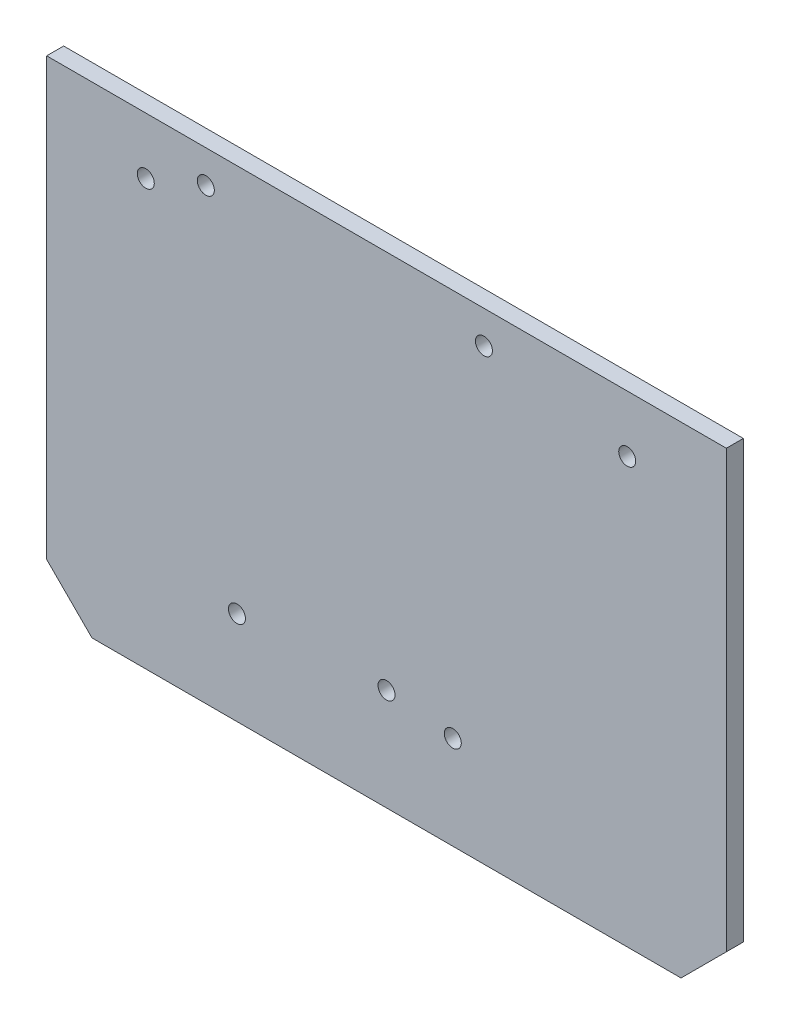
ISO-10303-21;
HEADER;
FILE_DESCRIPTION(('STEP AP214'),'2;1');
FILE_NAME('part.step','',(''),(''),'','','');
FILE_SCHEMA(('AUTOMOTIVE_DESIGN { 1 0 10303 214 1 1 1 1 }'));
ENDSEC;
DATA;
#1=APPLICATION_CONTEXT('core data for automotive mechanical design processes');
#2=APPLICATION_PROTOCOL_DEFINITION('international standard','automotive_design',2000,#1);
#3=PRODUCT_CONTEXT('',#1,'mechanical');
#4=PRODUCT('Part','Part','',(#3));
#5=PRODUCT_RELATED_PRODUCT_CATEGORY('part','',(#4));
#6=PRODUCT_DEFINITION_FORMATION('','',#4);
#7=PRODUCT_DEFINITION_CONTEXT('part definition',#1,'design');
#8=PRODUCT_DEFINITION('design','',#6,#7);
#9=PRODUCT_DEFINITION_SHAPE('','',#8);
#10=(LENGTH_UNIT() NAMED_UNIT(*) SI_UNIT(.MILLI.,.METRE.));
#11=(NAMED_UNIT(*) PLANE_ANGLE_UNIT() SI_UNIT($,.RADIAN.));
#12=(NAMED_UNIT(*) SI_UNIT($,.STERADIAN.) SOLID_ANGLE_UNIT());
#13=UNCERTAINTY_MEASURE_WITH_UNIT(LENGTH_MEASURE(1.E-05),#10,'distance_accuracy_value','');
#14=(GEOMETRIC_REPRESENTATION_CONTEXT(3) GLOBAL_UNCERTAINTY_ASSIGNED_CONTEXT((#13)) GLOBAL_UNIT_ASSIGNED_CONTEXT((#10,
#11,#12)) REPRESENTATION_CONTEXT('',''));
#15=CARTESIAN_POINT('',(0.,0.,0.));
#16=DIRECTION('',(0.,0.,1.));
#17=DIRECTION('',(1.,0.,0.));
#18=AXIS2_PLACEMENT_3D('',#15,#16,#17);
#19=CARTESIAN_POINT('',(60.,42.5,3.));
#20=DIRECTION('',(-1.,0.,0.));
#21=DIRECTION('',(0.,-1.,0.));
#22=AXIS2_PLACEMENT_3D('',#19,#20,#21);
#23=PLANE('',#22);
#24=DIRECTION('',(0.,1.,0.));
#25=VECTOR('',#24,1.);
#26=CARTESIAN_POINT('',(60.,42.5,3.));
#27=LINE('',#26,#25);
#28=CARTESIAN_POINT('',(60.,-34.5,3.));
#29=VERTEX_POINT('',#28);
#30=CARTESIAN_POINT('',(60.,42.5,3.));
#31=VERTEX_POINT('',#30);
#32=EDGE_CURVE('E91',#29,#31,#27,.T.);
#33=ORIENTED_EDGE('',*,*,#32,.F.);
#34=DIRECTION('',(0.,0.,-1.));
#35=VECTOR('',#34,1.);
#36=CARTESIAN_POINT('',(60.,-34.5,3.));
#37=LINE('',#36,#35);
#38=CARTESIAN_POINT('',(60.,-34.5,0.));
#39=VERTEX_POINT('',#38);
#40=EDGE_CURVE('E114',#29,#39,#37,.T.);
#41=ORIENTED_EDGE('',*,*,#40,.T.);
#42=DIRECTION('',(0.,1.,0.));
#43=VECTOR('',#42,1.);
#44=CARTESIAN_POINT('',(60.,42.5,0.));
#45=LINE('',#44,#43);
#46=CARTESIAN_POINT('',(60.,42.5,0.));
#47=VERTEX_POINT('',#46);
#48=EDGE_CURVE('E112',#39,#47,#45,.T.);
#49=ORIENTED_EDGE('',*,*,#48,.T.);
#50=DIRECTION('',(0.,0.,-1.));
#51=VECTOR('',#50,1.);
#52=CARTESIAN_POINT('',(60.,42.5,3.));
#53=LINE('',#52,#51);
#54=EDGE_CURVE('E106',#31,#47,#53,.T.);
#55=ORIENTED_EDGE('',*,*,#54,.F.);
#56=EDGE_LOOP('',(#33,#41,#49,#55));
#57=FACE_BOUND('',#56,.T.);
#58=ADVANCED_FACE('F37',(#57),#23,.F.);
#59=CARTESIAN_POINT('',(-60.,42.5,3.));
#60=DIRECTION('',(0.,-1.,0.));
#61=DIRECTION('',(0.,0.,-1.));
#62=AXIS2_PLACEMENT_3D('',#59,#60,#61);
#63=PLANE('',#62);
#64=DIRECTION('',(-1.,0.,0.));
#65=VECTOR('',#64,1.);
#66=CARTESIAN_POINT('',(-60.,42.5,0.));
#67=LINE('',#66,#65);
#68=CARTESIAN_POINT('',(-60.,42.5,0.));
#69=VERTEX_POINT('',#68);
#70=EDGE_CURVE('E141',#47,#69,#67,.T.);
#71=ORIENTED_EDGE('',*,*,#70,.T.);
#72=DIRECTION('',(0.,0.,-1.));
#73=VECTOR('',#72,1.);
#74=CARTESIAN_POINT('',(-60.,42.5,3.));
#75=LINE('',#74,#73);
#76=CARTESIAN_POINT('',(-60.,42.5,3.));
#77=VERTEX_POINT('',#76);
#78=EDGE_CURVE('E108',#77,#69,#75,.T.);
#79=ORIENTED_EDGE('',*,*,#78,.F.);
#80=DIRECTION('',(-1.,0.,0.));
#81=VECTOR('',#80,1.);
#82=CARTESIAN_POINT('',(-60.,42.5,3.));
#83=LINE('',#82,#81);
#84=EDGE_CURVE('E94',#31,#77,#83,.T.);
#85=ORIENTED_EDGE('',*,*,#84,.F.);
#86=ORIENTED_EDGE('',*,*,#54,.T.);
#87=EDGE_LOOP('',(#71,#79,#85,#86));
#88=FACE_BOUND('',#87,.T.);
#89=ADVANCED_FACE('F105',(#88),#63,.F.);
#90=CARTESIAN_POINT('',(-60.,42.5,3.));
#91=DIRECTION('',(1.,0.,0.));
#92=DIRECTION('',(0.,1.,0.));
#93=AXIS2_PLACEMENT_3D('',#90,#91,#92);
#94=PLANE('',#93);
#95=DIRECTION('',(0.,-1.,0.));
#96=VECTOR('',#95,1.);
#97=CARTESIAN_POINT('',(-60.,42.5,0.));
#98=LINE('',#97,#96);
#99=CARTESIAN_POINT('',(-60.,-34.5,0.));
#100=VERTEX_POINT('',#99);
#101=EDGE_CURVE('E139',#69,#100,#98,.T.);
#102=ORIENTED_EDGE('',*,*,#101,.T.);
#103=DIRECTION('',(0.,0.,1.));
#104=VECTOR('',#103,1.);
#105=CARTESIAN_POINT('',(-60.,-34.5,3.));
#106=LINE('',#105,#104);
#107=CARTESIAN_POINT('',(-60.,-34.5,3.));
#108=VERTEX_POINT('',#107);
#109=EDGE_CURVE('E11',#100,#108,#106,.T.);
#110=ORIENTED_EDGE('',*,*,#109,.T.);
#111=DIRECTION('',(0.,-1.,0.));
#112=VECTOR('',#111,1.);
#113=CARTESIAN_POINT('',(-60.,42.5,3.));
#114=LINE('',#113,#112);
#115=EDGE_CURVE('E109',#77,#108,#114,.T.);
#116=ORIENTED_EDGE('',*,*,#115,.F.);
#117=ORIENTED_EDGE('',*,*,#78,.T.);
#118=EDGE_LOOP('',(#102,#110,#116,#117));
#119=FACE_BOUND('',#118,.T.);
#120=ADVANCED_FACE('F140',(#119),#94,.F.);
#121=CARTESIAN_POINT('',(-60.,-42.5,3.));
#122=DIRECTION('',(0.,1.,0.));
#123=DIRECTION('',(0.,0.,1.));
#124=AXIS2_PLACEMENT_3D('',#121,#122,#123);
#125=PLANE('',#124);
#126=DIRECTION('',(1.,0.,0.));
#127=VECTOR('',#126,1.);
#128=CARTESIAN_POINT('',(-60.,-42.5,0.));
#129=LINE('',#128,#127);
#130=CARTESIAN_POINT('',(-52.,-42.5,0.));
#131=VERTEX_POINT('',#130);
#132=CARTESIAN_POINT('',(52.,-42.5,0.));
#133=VERTEX_POINT('',#132);
#134=EDGE_CURVE('E101',#131,#133,#129,.T.);
#135=ORIENTED_EDGE('',*,*,#134,.T.);
#136=DIRECTION('',(0.,0.,1.));
#137=VECTOR('',#136,1.);
#138=CARTESIAN_POINT('',(52.,-42.5,3.));
#139=LINE('',#138,#137);
#140=CARTESIAN_POINT('',(52.,-42.5,3.));
#141=VERTEX_POINT('',#140);
#142=EDGE_CURVE('E58',#133,#141,#139,.T.);
#143=ORIENTED_EDGE('',*,*,#142,.T.);
#144=DIRECTION('',(1.,0.,0.));
#145=VECTOR('',#144,1.);
#146=CARTESIAN_POINT('',(-60.,-42.5,3.));
#147=LINE('',#146,#145);
#148=CARTESIAN_POINT('',(-52.,-42.5,3.));
#149=VERTEX_POINT('',#148);
#150=EDGE_CURVE('E118',#149,#141,#147,.T.);
#151=ORIENTED_EDGE('',*,*,#150,.F.);
#152=DIRECTION('',(0.,0.,-1.));
#153=VECTOR('',#152,1.);
#154=CARTESIAN_POINT('',(-52.,-42.5,3.));
#155=LINE('',#154,#153);
#156=EDGE_CURVE('E125',#149,#131,#155,.T.);
#157=ORIENTED_EDGE('',*,*,#156,.T.);
#158=EDGE_LOOP('',(#135,#143,#151,#157));
#159=FACE_BOUND('',#158,.T.);
#160=ADVANCED_FACE('F133',(#159),#125,.F.);
#161=CARTESIAN_POINT('',(0.,0.,3.));
#162=DIRECTION('',(0.,0.,1.));
#163=DIRECTION('',(1.,0.,0.));
#164=AXIS2_PLACEMENT_3D('',#161,#162,#163);
#165=PLANE('',#164);
#166=CARTESIAN_POINT('',(-26.4004587707545,-26.,3.));
#167=DIRECTION('',(0.,0.,1.));
#168=DIRECTION('',(1.,0.,0.));
#169=AXIS2_PLACEMENT_3D('',#166,#167,#168);
#170=CIRCLE('',#169,1.5);
#171=CARTESIAN_POINT('',(-24.9004587707545,-26.,3.));
#172=VERTEX_POINT('',#171);
#173=EDGE_CURVE('E184',#172,#172,#170,.T.);
#174=ORIENTED_EDGE('',*,*,#173,.F.);
#175=EDGE_LOOP('',(#174));
#176=FACE_BOUND('',#175,.T.);
#177=CARTESIAN_POINT('',(11.6995412292455,-26.,3.));
#178=DIRECTION('',(0.,0.,1.));
#179=DIRECTION('',(-1.,0.,0.));
#180=AXIS2_PLACEMENT_3D('',#177,#178,#179);
#181=CIRCLE('',#180,1.5);
#182=CARTESIAN_POINT('',(10.1995412292455,-26.,3.));
#183=VERTEX_POINT('',#182);
#184=EDGE_CURVE('E178',#183,#183,#181,.T.);
#185=ORIENTED_EDGE('',*,*,#184,.F.);
#186=EDGE_LOOP('',(#185));
#187=FACE_BOUND('',#186,.T.);
#188=CARTESIAN_POINT('',(17.1995412292455,36.7375485654325,3.));
#189=DIRECTION('',(0.,0.,1.));
#190=DIRECTION('',(-1.,0.,0.));
#191=AXIS2_PLACEMENT_3D('',#188,#189,#190);
#192=CIRCLE('',#191,1.5);
#193=CARTESIAN_POINT('',(15.6995412292455,36.7375485654325,3.));
#194=VERTEX_POINT('',#193);
#195=EDGE_CURVE('E172',#194,#194,#192,.T.);
#196=ORIENTED_EDGE('',*,*,#195,.F.);
#197=EDGE_LOOP('',(#196));
#198=FACE_BOUND('',#197,.T.);
#199=CARTESIAN_POINT('',(-31.9004587707545,36.7375485654325,3.));
#200=DIRECTION('',(0.,0.,1.));
#201=DIRECTION('',(1.,0.,0.));
#202=AXIS2_PLACEMENT_3D('',#199,#200,#201);
#203=CIRCLE('',#202,1.5);
#204=CARTESIAN_POINT('',(-30.4004587707545,36.7375485654325,3.));
#205=VERTEX_POINT('',#204);
#206=EDGE_CURVE('E166',#205,#205,#203,.T.);
#207=ORIENTED_EDGE('',*,*,#206,.F.);
#208=EDGE_LOOP('',(#207));
#209=FACE_BOUND('',#208,.T.);
#210=CARTESIAN_POINT('',(0.,-24.5,3.));
#211=DIRECTION('',(0.,0.,1.));
#212=DIRECTION('',(1.,0.,0.));
#213=AXIS2_PLACEMENT_3D('',#210,#211,#212);
#214=CIRCLE('',#213,1.5);
#215=CARTESIAN_POINT('',(1.50000000000001,-24.5,3.));
#216=VERTEX_POINT('',#215);
#217=EDGE_CURVE('E161',#216,#216,#214,.T.);
#218=ORIENTED_EDGE('',*,*,#217,.F.);
#219=EDGE_LOOP('',(#218));
#220=FACE_BOUND('',#219,.T.);
#221=CARTESIAN_POINT('',(42.5,32.5,3.));
#222=DIRECTION('',(0.,0.,1.));
#223=DIRECTION('',(-1.,0.,0.));
#224=AXIS2_PLACEMENT_3D('',#221,#222,#223);
#225=CIRCLE('',#224,1.5);
#226=CARTESIAN_POINT('',(41.,32.5,3.));
#227=VERTEX_POINT('',#226);
#228=EDGE_CURVE('E154',#227,#227,#225,.T.);
#229=ORIENTED_EDGE('',*,*,#228,.F.);
#230=EDGE_LOOP('',(#229));
#231=FACE_BOUND('',#230,.T.);
#232=CARTESIAN_POINT('',(-42.5,32.5,3.));
#233=DIRECTION('',(0.,0.,1.));
#234=DIRECTION('',(1.,0.,0.));
#235=AXIS2_PLACEMENT_3D('',#232,#233,#234);
#236=CIRCLE('',#235,1.5);
#237=CARTESIAN_POINT('',(-41.,32.5,3.));
#238=VERTEX_POINT('',#237);
#239=EDGE_CURVE('E148',#238,#238,#236,.T.);
#240=ORIENTED_EDGE('',*,*,#239,.F.);
#241=EDGE_LOOP('',(#240));
#242=FACE_BOUND('',#241,.T.);
#243=ORIENTED_EDGE('',*,*,#150,.T.);
#244=DIRECTION('',(-0.707106781186549,-0.707106781186546,0.));
#245=VECTOR('',#244,1.);
#246=CARTESIAN_POINT('',(47.2499999999999,-47.2500000000001,3.));
#247=LINE('',#246,#245);
#248=EDGE_CURVE('E45',#141,#29,#247,.F.);
#249=ORIENTED_EDGE('',*,*,#248,.T.);
#250=ORIENTED_EDGE('',*,*,#32,.T.);
#251=ORIENTED_EDGE('',*,*,#84,.T.);
#252=ORIENTED_EDGE('',*,*,#115,.T.);
#253=DIRECTION('',(-0.707106781186546,0.707106781186549,0.));
#254=VECTOR('',#253,1.);
#255=CARTESIAN_POINT('',(-47.2500000000001,-47.2499999999999,3.));
#256=LINE('',#255,#254);
#257=EDGE_CURVE('E129',#108,#149,#256,.F.);
#258=ORIENTED_EDGE('',*,*,#257,.T.);
#259=EDGE_LOOP('',(#243,#249,#250,#251,#252,#258));
#260=FACE_BOUND('',#259,.T.);
#261=ADVANCED_FACE('F93',(#176,#187,#198,#209,#220,#231,#242,#260),#165,.T.);
#262=CARTESIAN_POINT('',(0.,0.,0.));
#263=DIRECTION('',(0.,0.,1.));
#264=DIRECTION('',(1.,0.,0.));
#265=AXIS2_PLACEMENT_3D('',#262,#263,#264);
#266=PLANE('',#265);
#267=CARTESIAN_POINT('',(-26.4004587707545,-26.,0.));
#268=DIRECTION('',(0.,0.,1.));
#269=DIRECTION('',(1.,0.,0.));
#270=AXIS2_PLACEMENT_3D('',#267,#268,#269);
#271=CIRCLE('',#270,1.5);
#272=CARTESIAN_POINT('',(-24.9004587707545,-26.,0.));
#273=VERTEX_POINT('',#272);
#274=EDGE_CURVE('E169',#273,#273,#271,.T.);
#275=ORIENTED_EDGE('',*,*,#274,.T.);
#276=EDGE_LOOP('',(#275));
#277=FACE_BOUND('',#276,.T.);
#278=CARTESIAN_POINT('',(11.6995412292455,-26.,0.));
#279=DIRECTION('',(0.,0.,1.));
#280=DIRECTION('',(-1.,0.,0.));
#281=AXIS2_PLACEMENT_3D('',#278,#279,#280);
#282=CIRCLE('',#281,1.5);
#283=CARTESIAN_POINT('',(10.1995412292455,-26.,0.));
#284=VERTEX_POINT('',#283);
#285=EDGE_CURVE('E181',#284,#284,#282,.T.);
#286=ORIENTED_EDGE('',*,*,#285,.T.);
#287=EDGE_LOOP('',(#286));
#288=FACE_BOUND('',#287,.T.);
#289=CARTESIAN_POINT('',(17.1995412292455,36.7375485654325,0.));
#290=DIRECTION('',(0.,0.,1.));
#291=DIRECTION('',(-1.,0.,0.));
#292=AXIS2_PLACEMENT_3D('',#289,#290,#291);
#293=CIRCLE('',#292,1.5);
#294=CARTESIAN_POINT('',(15.6995412292455,36.7375485654325,0.));
#295=VERTEX_POINT('',#294);
#296=EDGE_CURVE('E175',#295,#295,#293,.T.);
#297=ORIENTED_EDGE('',*,*,#296,.T.);
#298=EDGE_LOOP('',(#297));
#299=FACE_BOUND('',#298,.T.);
#300=CARTESIAN_POINT('',(-31.9004587707545,36.7375485654325,0.));
#301=DIRECTION('',(0.,0.,1.));
#302=DIRECTION('',(1.,0.,0.));
#303=AXIS2_PLACEMENT_3D('',#300,#301,#302);
#304=CIRCLE('',#303,1.5);
#305=CARTESIAN_POINT('',(-30.4004587707545,36.7375485654325,0.));
#306=VERTEX_POINT('',#305);
#307=EDGE_CURVE('E158',#306,#306,#304,.T.);
#308=ORIENTED_EDGE('',*,*,#307,.T.);
#309=EDGE_LOOP('',(#308));
#310=FACE_BOUND('',#309,.T.);
#311=CARTESIAN_POINT('',(0.,-24.5,0.));
#312=DIRECTION('',(0.,0.,1.));
#313=DIRECTION('',(1.,0.,0.));
#314=AXIS2_PLACEMENT_3D('',#311,#312,#313);
#315=CIRCLE('',#314,1.5);
#316=CARTESIAN_POINT('',(1.50000000000001,-24.5,0.));
#317=VERTEX_POINT('',#316);
#318=EDGE_CURVE('E151',#317,#317,#315,.T.);
#319=ORIENTED_EDGE('',*,*,#318,.T.);
#320=EDGE_LOOP('',(#319));
#321=FACE_BOUND('',#320,.T.);
#322=CARTESIAN_POINT('',(42.5,32.5,0.));
#323=DIRECTION('',(0.,0.,1.));
#324=DIRECTION('',(-1.,0.,0.));
#325=AXIS2_PLACEMENT_3D('',#322,#323,#324);
#326=CIRCLE('',#325,1.5);
#327=CARTESIAN_POINT('',(41.,32.5,0.));
#328=VERTEX_POINT('',#327);
#329=EDGE_CURVE('E157',#328,#328,#326,.T.);
#330=ORIENTED_EDGE('',*,*,#329,.T.);
#331=EDGE_LOOP('',(#330));
#332=FACE_BOUND('',#331,.T.);
#333=CARTESIAN_POINT('',(-42.5,32.5,0.));
#334=DIRECTION('',(0.,0.,1.));
#335=DIRECTION('',(1.,0.,0.));
#336=AXIS2_PLACEMENT_3D('',#333,#334,#335);
#337=CIRCLE('',#336,1.5);
#338=CARTESIAN_POINT('',(-41.,32.5,0.));
#339=VERTEX_POINT('',#338);
#340=EDGE_CURVE('E145',#339,#339,#337,.T.);
#341=ORIENTED_EDGE('',*,*,#340,.T.);
#342=EDGE_LOOP('',(#341));
#343=FACE_BOUND('',#342,.T.);
#344=ORIENTED_EDGE('',*,*,#48,.F.);
#345=DIRECTION('',(0.707106781186549,0.707106781186546,0.));
#346=VECTOR('',#345,1.);
#347=CARTESIAN_POINT('',(60.,-34.5,0.));
#348=LINE('',#347,#346);
#349=EDGE_CURVE('E123',#39,#133,#348,.F.);
#350=ORIENTED_EDGE('',*,*,#349,.T.);
#351=ORIENTED_EDGE('',*,*,#134,.F.);
#352=DIRECTION('',(0.707106781186546,-0.707106781186549,0.));
#353=VECTOR('',#352,1.);
#354=CARTESIAN_POINT('',(-52.,-42.5,0.));
#355=LINE('',#354,#353);
#356=EDGE_CURVE('E116',#131,#100,#355,.F.);
#357=ORIENTED_EDGE('',*,*,#356,.T.);
#358=ORIENTED_EDGE('',*,*,#101,.F.);
#359=ORIENTED_EDGE('',*,*,#70,.F.);
#360=EDGE_LOOP('',(#344,#350,#351,#357,#358,#359));
#361=FACE_BOUND('',#360,.T.);
#362=ADVANCED_FACE('F138',(#277,#288,#299,#310,#321,#332,#343,#361),#266,.F.);
#363=CARTESIAN_POINT('',(-42.5,32.5,0.));
#364=DIRECTION('',(0.,0.,1.));
#365=DIRECTION('',(1.,0.,0.));
#366=AXIS2_PLACEMENT_3D('',#363,#364,#365);
#367=CYLINDRICAL_SURFACE('',#366,1.5);
#368=ORIENTED_EDGE('',*,*,#340,.F.);
#369=EDGE_LOOP('',(#368));
#370=FACE_BOUND('',#369,.T.);
#371=ORIENTED_EDGE('',*,*,#239,.T.);
#372=EDGE_LOOP('',(#371));
#373=FACE_BOUND('',#372,.T.);
#374=ADVANCED_FACE('F214',(#370,#373),#367,.F.);
#375=CARTESIAN_POINT('',(42.5,32.5,0.));
#376=DIRECTION('',(0.,0.,1.));
#377=DIRECTION('',(1.,0.,0.));
#378=AXIS2_PLACEMENT_3D('',#375,#376,#377);
#379=CYLINDRICAL_SURFACE('',#378,1.5);
#380=ORIENTED_EDGE('',*,*,#329,.F.);
#381=EDGE_LOOP('',(#380));
#382=FACE_BOUND('',#381,.T.);
#383=ORIENTED_EDGE('',*,*,#228,.T.);
#384=EDGE_LOOP('',(#383));
#385=FACE_BOUND('',#384,.T.);
#386=ADVANCED_FACE('F216',(#382,#385),#379,.F.);
#387=CARTESIAN_POINT('',(0.,-24.5,0.));
#388=DIRECTION('',(0.,0.,1.));
#389=DIRECTION('',(1.,0.,0.));
#390=AXIS2_PLACEMENT_3D('',#387,#388,#389);
#391=CYLINDRICAL_SURFACE('',#390,1.5);
#392=ORIENTED_EDGE('',*,*,#318,.F.);
#393=EDGE_LOOP('',(#392));
#394=FACE_BOUND('',#393,.T.);
#395=ORIENTED_EDGE('',*,*,#217,.T.);
#396=EDGE_LOOP('',(#395));
#397=FACE_BOUND('',#396,.T.);
#398=ADVANCED_FACE('F223',(#394,#397),#391,.F.);
#399=CARTESIAN_POINT('',(60.,-34.5,3.));
#400=DIRECTION('',(-0.707106781186546,0.707106781186549,0.));
#401=DIRECTION('',(0.,0.,-1.));
#402=AXIS2_PLACEMENT_3D('',#399,#400,#401);
#403=PLANE('',#402);
#404=ORIENTED_EDGE('',*,*,#248,.F.);
#405=ORIENTED_EDGE('',*,*,#142,.F.);
#406=ORIENTED_EDGE('',*,*,#349,.F.);
#407=ORIENTED_EDGE('',*,*,#40,.F.);
#408=EDGE_LOOP('',(#404,#405,#406,#407));
#409=FACE_BOUND('',#408,.T.);
#410=ADVANCED_FACE('F236',(#409),#403,.F.);
#411=CARTESIAN_POINT('',(-52.,-42.5,3.));
#412=DIRECTION('',(0.707106781186549,0.707106781186546,0.));
#413=DIRECTION('',(0.,0.,-1.));
#414=AXIS2_PLACEMENT_3D('',#411,#412,#413);
#415=PLANE('',#414);
#416=ORIENTED_EDGE('',*,*,#257,.F.);
#417=ORIENTED_EDGE('',*,*,#109,.F.);
#418=ORIENTED_EDGE('',*,*,#356,.F.);
#419=ORIENTED_EDGE('',*,*,#156,.F.);
#420=EDGE_LOOP('',(#416,#417,#418,#419));
#421=FACE_BOUND('',#420,.T.);
#422=ADVANCED_FACE('F39',(#421),#415,.F.);
#423=CARTESIAN_POINT('',(-31.9004587707545,36.7375485654325,0.));
#424=DIRECTION('',(0.,0.,1.));
#425=DIRECTION('',(1.,0.,0.));
#426=AXIS2_PLACEMENT_3D('',#423,#424,#425);
#427=CYLINDRICAL_SURFACE('',#426,1.5);
#428=ORIENTED_EDGE('',*,*,#307,.F.);
#429=EDGE_LOOP('',(#428));
#430=FACE_BOUND('',#429,.T.);
#431=ORIENTED_EDGE('',*,*,#206,.T.);
#432=EDGE_LOOP('',(#431));
#433=FACE_BOUND('',#432,.T.);
#434=ADVANCED_FACE('F243',(#430,#433),#427,.F.);
#435=CARTESIAN_POINT('',(17.1995412292455,36.7375485654325,0.));
#436=DIRECTION('',(0.,0.,1.));
#437=DIRECTION('',(1.,0.,0.));
#438=AXIS2_PLACEMENT_3D('',#435,#436,#437);
#439=CYLINDRICAL_SURFACE('',#438,1.5);
#440=ORIENTED_EDGE('',*,*,#296,.F.);
#441=EDGE_LOOP('',(#440));
#442=FACE_BOUND('',#441,.T.);
#443=ORIENTED_EDGE('',*,*,#195,.T.);
#444=EDGE_LOOP('',(#443));
#445=FACE_BOUND('',#444,.T.);
#446=ADVANCED_FACE('F253',(#442,#445),#439,.F.);
#447=CARTESIAN_POINT('',(11.6995412292455,-26.,0.));
#448=DIRECTION('',(0.,0.,1.));
#449=DIRECTION('',(1.,0.,0.));
#450=AXIS2_PLACEMENT_3D('',#447,#448,#449);
#451=CYLINDRICAL_SURFACE('',#450,1.5);
#452=ORIENTED_EDGE('',*,*,#285,.F.);
#453=EDGE_LOOP('',(#452));
#454=FACE_BOUND('',#453,.T.);
#455=ORIENTED_EDGE('',*,*,#184,.T.);
#456=EDGE_LOOP('',(#455));
#457=FACE_BOUND('',#456,.T.);
#458=ADVANCED_FACE('F195',(#454,#457),#451,.F.);
#459=CARTESIAN_POINT('',(-26.4004587707545,-26.,0.));
#460=DIRECTION('',(0.,0.,1.));
#461=DIRECTION('',(1.,0.,0.));
#462=AXIS2_PLACEMENT_3D('',#459,#460,#461);
#463=CYLINDRICAL_SURFACE('',#462,1.5);
#464=ORIENTED_EDGE('',*,*,#274,.F.);
#465=EDGE_LOOP('',(#464));
#466=FACE_BOUND('',#465,.T.);
#467=ORIENTED_EDGE('',*,*,#173,.T.);
#468=EDGE_LOOP('',(#467));
#469=FACE_BOUND('',#468,.T.);
#470=ADVANCED_FACE('F192',(#466,#469),#463,.F.);
#471=CLOSED_SHELL('',(#58,#89,#120,#160,#261,#362,#374,#386,#398,#410,#422,#434,#446,#458,#470));
#472=MANIFOLD_SOLID_BREP('B2',#471);
#473=ADVANCED_BREP_SHAPE_REPRESENTATION('',(#18,#472),#14);
#474=SHAPE_DEFINITION_REPRESENTATION(#9,#473);
ENDSEC;
END-ISO-10303-21;
